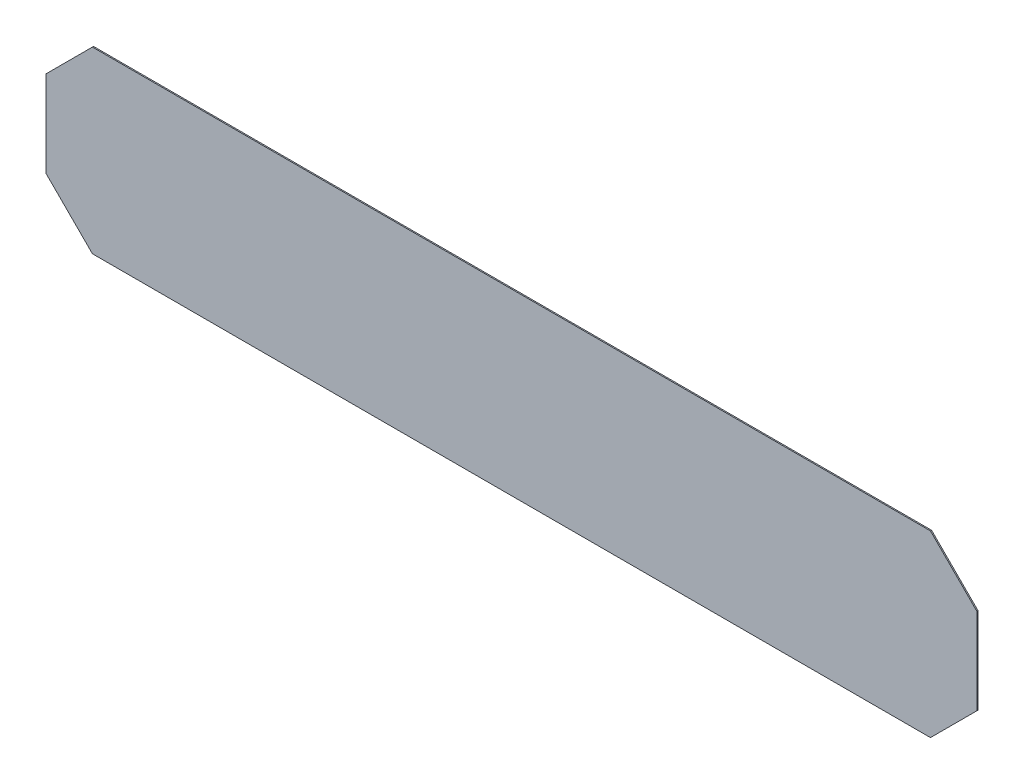
ISO-10303-21;
HEADER;
FILE_DESCRIPTION(('STEP AP214'),'2;1');
FILE_NAME('part.step','',(''),(''),'','','');
FILE_SCHEMA(('AUTOMOTIVE_DESIGN { 1 0 10303 214 1 1 1 1 }'));
ENDSEC;
DATA;
#1=APPLICATION_CONTEXT('core data for automotive mechanical design processes');
#2=APPLICATION_PROTOCOL_DEFINITION('international standard','automotive_design',2000,#1);
#3=PRODUCT_CONTEXT('',#1,'mechanical');
#4=PRODUCT('Part','Part','',(#3));
#5=PRODUCT_RELATED_PRODUCT_CATEGORY('part','',(#4));
#6=PRODUCT_DEFINITION_FORMATION('','',#4);
#7=PRODUCT_DEFINITION_CONTEXT('part definition',#1,'design');
#8=PRODUCT_DEFINITION('design','',#6,#7);
#9=PRODUCT_DEFINITION_SHAPE('','',#8);
#10=(LENGTH_UNIT() NAMED_UNIT(*) SI_UNIT(.MILLI.,.METRE.));
#11=(NAMED_UNIT(*) PLANE_ANGLE_UNIT() SI_UNIT($,.RADIAN.));
#12=(NAMED_UNIT(*) SI_UNIT($,.STERADIAN.) SOLID_ANGLE_UNIT());
#13=UNCERTAINTY_MEASURE_WITH_UNIT(LENGTH_MEASURE(1.E-05),#10,'distance_accuracy_value','');
#14=(GEOMETRIC_REPRESENTATION_CONTEXT(3) GLOBAL_UNCERTAINTY_ASSIGNED_CONTEXT((#13)) GLOBAL_UNIT_ASSIGNED_CONTEXT((#10,
#11,#12)) REPRESENTATION_CONTEXT('',''));
#15=CARTESIAN_POINT('',(0.,0.,0.));
#16=DIRECTION('',(0.,0.,1.));
#17=DIRECTION('',(1.,0.,0.));
#18=AXIS2_PLACEMENT_3D('',#15,#16,#17);
#19=CARTESIAN_POINT('',(41.275,7.9375,0.1016));
#20=DIRECTION('',(-1.,0.,0.));
#21=DIRECTION('',(0.,0.,1.));
#22=AXIS2_PLACEMENT_3D('',#19,#20,#21);
#23=PLANE('',#22);
#24=DIRECTION('',(0.,1.,0.));
#25=VECTOR('',#24,1.);
#26=CARTESIAN_POINT('',(41.275,7.9375,0.1016));
#27=LINE('',#26,#25);
#28=CARTESIAN_POINT('',(41.275,-3.82269999999998,0.1016));
#29=VERTEX_POINT('',#28);
#30=CARTESIAN_POINT('',(41.275,3.8227,0.1016));
#31=VERTEX_POINT('',#30);
#32=EDGE_CURVE('E130',#29,#31,#27,.T.);
#33=ORIENTED_EDGE('',*,*,#32,.F.);
#34=DIRECTION('',(0.,0.,-1.));
#35=VECTOR('',#34,1.);
#36=CARTESIAN_POINT('',(41.275,-3.82269999999998,0.1016));
#37=LINE('',#36,#35);
#38=CARTESIAN_POINT('',(41.275,-3.82269999999998,0.));
#39=VERTEX_POINT('',#38);
#40=EDGE_CURVE('E11',#29,#39,#37,.T.);
#41=ORIENTED_EDGE('',*,*,#40,.T.);
#42=DIRECTION('',(0.,1.,0.));
#43=VECTOR('',#42,1.);
#44=CARTESIAN_POINT('',(41.275,7.9375,0.));
#45=LINE('',#44,#43);
#46=CARTESIAN_POINT('',(41.275,3.8227,0.));
#47=VERTEX_POINT('',#46);
#48=EDGE_CURVE('E132',#39,#47,#45,.T.);
#49=ORIENTED_EDGE('',*,*,#48,.T.);
#50=DIRECTION('',(0.,0.,1.));
#51=VECTOR('',#50,1.);
#52=CARTESIAN_POINT('',(41.275,3.8227,0.1016));
#53=LINE('',#52,#51);
#54=EDGE_CURVE('E43',#47,#31,#53,.T.);
#55=ORIENTED_EDGE('',*,*,#54,.T.);
#56=EDGE_LOOP('',(#33,#41,#49,#55));
#57=FACE_BOUND('',#56,.T.);
#58=ADVANCED_FACE('F35',(#57),#23,.F.);
#59=CARTESIAN_POINT('',(-41.275,7.9375,0.1016));
#60=DIRECTION('',(0.,-1.,0.));
#61=DIRECTION('',(0.,0.,-1.));
#62=AXIS2_PLACEMENT_3D('',#59,#60,#61);
#63=PLANE('',#62);
#64=DIRECTION('',(-1.,0.,0.));
#65=VECTOR('',#64,1.);
#66=CARTESIAN_POINT('',(-41.275,7.9375,0.));
#67=LINE('',#66,#65);
#68=CARTESIAN_POINT('',(37.1602,7.9375,0.));
#69=VERTEX_POINT('',#68);
#70=CARTESIAN_POINT('',(-37.1602,7.9375,0.));
#71=VERTEX_POINT('',#70);
#72=EDGE_CURVE('E128',#69,#71,#67,.T.);
#73=ORIENTED_EDGE('',*,*,#72,.T.);
#74=DIRECTION('',(0.,0.,1.));
#75=VECTOR('',#74,1.);
#76=CARTESIAN_POINT('',(-37.1602,7.9375,0.1016));
#77=LINE('',#76,#75);
#78=CARTESIAN_POINT('',(-37.1602,7.9375,0.1016));
#79=VERTEX_POINT('',#78);
#80=EDGE_CURVE('E107',#71,#79,#77,.T.);
#81=ORIENTED_EDGE('',*,*,#80,.T.);
#82=DIRECTION('',(-1.,0.,0.));
#83=VECTOR('',#82,1.);
#84=CARTESIAN_POINT('',(-41.275,7.9375,0.1016));
#85=LINE('',#84,#83);
#86=CARTESIAN_POINT('',(37.1602,7.9375,0.1016));
#87=VERTEX_POINT('',#86);
#88=EDGE_CURVE('E168',#87,#79,#85,.T.);
#89=ORIENTED_EDGE('',*,*,#88,.F.);
#90=DIRECTION('',(0.,0.,-1.));
#91=VECTOR('',#90,1.);
#92=CARTESIAN_POINT('',(37.1602,7.9375,0.1016));
#93=LINE('',#92,#91);
#94=EDGE_CURVE('E112',#87,#69,#93,.T.);
#95=ORIENTED_EDGE('',*,*,#94,.T.);
#96=EDGE_LOOP('',(#73,#81,#89,#95));
#97=FACE_BOUND('',#96,.T.);
#98=ADVANCED_FACE('F172',(#97),#63,.F.);
#99=CARTESIAN_POINT('',(-41.275,7.9375,0.1016));
#100=DIRECTION('',(1.,0.,0.));
#101=DIRECTION('',(0.,0.,-1.));
#102=AXIS2_PLACEMENT_3D('',#99,#100,#101);
#103=PLANE('',#102);
#104=DIRECTION('',(0.,-1.,0.));
#105=VECTOR('',#104,1.);
#106=CARTESIAN_POINT('',(-41.275,7.9375,0.1016));
#107=LINE('',#106,#105);
#108=CARTESIAN_POINT('',(-41.275,3.82269999999998,0.1016));
#109=VERTEX_POINT('',#108);
#110=CARTESIAN_POINT('',(-41.275,-3.8227,0.1016));
#111=VERTEX_POINT('',#110);
#112=EDGE_CURVE('E121',#109,#111,#107,.T.);
#113=ORIENTED_EDGE('',*,*,#112,.F.);
#114=DIRECTION('',(0.,0.,-1.));
#115=VECTOR('',#114,1.);
#116=CARTESIAN_POINT('',(-41.275,3.82269999999998,0.1016));
#117=LINE('',#116,#115);
#118=CARTESIAN_POINT('',(-41.275,3.82269999999998,0.));
#119=VERTEX_POINT('',#118);
#120=EDGE_CURVE('E106',#109,#119,#117,.T.);
#121=ORIENTED_EDGE('',*,*,#120,.T.);
#122=DIRECTION('',(0.,-1.,0.));
#123=VECTOR('',#122,1.);
#124=CARTESIAN_POINT('',(-41.275,7.9375,0.));
#125=LINE('',#124,#123);
#126=CARTESIAN_POINT('',(-41.275,-3.8227,0.));
#127=VERTEX_POINT('',#126);
#128=EDGE_CURVE('E119',#119,#127,#125,.T.);
#129=ORIENTED_EDGE('',*,*,#128,.T.);
#130=DIRECTION('',(0.,0.,1.));
#131=VECTOR('',#130,1.);
#132=CARTESIAN_POINT('',(-41.275,-3.8227,0.1016));
#133=LINE('',#132,#131);
#134=EDGE_CURVE('E123',#127,#111,#133,.T.);
#135=ORIENTED_EDGE('',*,*,#134,.T.);
#136=EDGE_LOOP('',(#113,#121,#129,#135));
#137=FACE_BOUND('',#136,.T.);
#138=ADVANCED_FACE('F118',(#137),#103,.F.);
#139=CARTESIAN_POINT('',(-41.275,-7.9375,0.1016));
#140=DIRECTION('',(0.,1.,0.));
#141=DIRECTION('',(0.,0.,1.));
#142=AXIS2_PLACEMENT_3D('',#139,#140,#141);
#143=PLANE('',#142);
#144=DIRECTION('',(1.,0.,0.));
#145=VECTOR('',#144,1.);
#146=CARTESIAN_POINT('',(-41.275,-7.9375,0.1016));
#147=LINE('',#146,#145);
#148=CARTESIAN_POINT('',(-37.1602,-7.9375,0.1016));
#149=VERTEX_POINT('',#148);
#150=CARTESIAN_POINT('',(37.1602,-7.9375,0.1016));
#151=VERTEX_POINT('',#150);
#152=EDGE_CURVE('E136',#149,#151,#147,.T.);
#153=ORIENTED_EDGE('',*,*,#152,.F.);
#154=DIRECTION('',(0.,0.,-1.));
#155=VECTOR('',#154,1.);
#156=CARTESIAN_POINT('',(-37.1602,-7.9375,0.1016));
#157=LINE('',#156,#155);
#158=CARTESIAN_POINT('',(-37.1602,-7.9375,0.));
#159=VERTEX_POINT('',#158);
#160=EDGE_CURVE('E153',#149,#159,#157,.T.);
#161=ORIENTED_EDGE('',*,*,#160,.T.);
#162=DIRECTION('',(1.,0.,0.));
#163=VECTOR('',#162,1.);
#164=CARTESIAN_POINT('',(-41.275,-7.9375,0.));
#165=LINE('',#164,#163);
#166=CARTESIAN_POINT('',(37.1602,-7.9375,0.));
#167=VERTEX_POINT('',#166);
#168=EDGE_CURVE('E127',#159,#167,#165,.T.);
#169=ORIENTED_EDGE('',*,*,#168,.T.);
#170=DIRECTION('',(0.,0.,1.));
#171=VECTOR('',#170,1.);
#172=CARTESIAN_POINT('',(37.1602,-7.9375,0.1016));
#173=LINE('',#172,#171);
#174=EDGE_CURVE('E50',#167,#151,#173,.T.);
#175=ORIENTED_EDGE('',*,*,#174,.T.);
#176=EDGE_LOOP('',(#153,#161,#169,#175));
#177=FACE_BOUND('',#176,.T.);
#178=ADVANCED_FACE('F179',(#177),#143,.F.);
#179=CARTESIAN_POINT('',(0.,0.,0.1016));
#180=DIRECTION('',(0.,0.,1.));
#181=DIRECTION('',(1.,0.,0.));
#182=AXIS2_PLACEMENT_3D('',#179,#180,#181);
#183=PLANE('',#182);
#184=ORIENTED_EDGE('',*,*,#88,.T.);
#185=DIRECTION('',(0.707106781186548,0.707106781186548,0.));
#186=VECTOR('',#185,1.);
#187=CARTESIAN_POINT('',(-22.54885,22.54885,0.1016));
#188=LINE('',#187,#186);
#189=EDGE_CURVE('E150',#79,#109,#188,.F.);
#190=ORIENTED_EDGE('',*,*,#189,.T.);
#191=ORIENTED_EDGE('',*,*,#112,.T.);
#192=DIRECTION('',(-0.707106781186548,0.707106781186548,0.));
#193=VECTOR('',#192,1.);
#194=CARTESIAN_POINT('',(-22.54885,-22.54885,0.1016));
#195=LINE('',#194,#193);
#196=EDGE_CURVE('E57',#111,#149,#195,.F.);
#197=ORIENTED_EDGE('',*,*,#196,.T.);
#198=ORIENTED_EDGE('',*,*,#152,.T.);
#199=DIRECTION('',(-0.707106781186548,-0.707106781186548,0.));
#200=VECTOR('',#199,1.);
#201=CARTESIAN_POINT('',(22.54885,-22.54885,0.1016));
#202=LINE('',#201,#200);
#203=EDGE_CURVE('E147',#151,#29,#202,.F.);
#204=ORIENTED_EDGE('',*,*,#203,.T.);
#205=ORIENTED_EDGE('',*,*,#32,.T.);
#206=DIRECTION('',(0.707106781186548,-0.707106781186548,0.));
#207=VECTOR('',#206,1.);
#208=CARTESIAN_POINT('',(22.54885,22.54885,0.1016));
#209=LINE('',#208,#207);
#210=EDGE_CURVE('E145',#31,#87,#209,.F.);
#211=ORIENTED_EDGE('',*,*,#210,.T.);
#212=EDGE_LOOP('',(#184,#190,#191,#197,#198,#204,#205,#211));
#213=FACE_BOUND('',#212,.T.);
#214=ADVANCED_FACE('F165',(#213),#183,.T.);
#215=CARTESIAN_POINT('',(0.,0.,0.));
#216=DIRECTION('',(0.,0.,1.));
#217=DIRECTION('',(1.,0.,0.));
#218=AXIS2_PLACEMENT_3D('',#215,#216,#217);
#219=PLANE('',#218);
#220=ORIENTED_EDGE('',*,*,#128,.F.);
#221=DIRECTION('',(-0.707106781186548,-0.707106781186548,0.));
#222=VECTOR('',#221,1.);
#223=CARTESIAN_POINT('',(-41.275,3.82269999999998,0.));
#224=LINE('',#223,#222);
#225=EDGE_CURVE('E102',#119,#71,#224,.F.);
#226=ORIENTED_EDGE('',*,*,#225,.T.);
#227=ORIENTED_EDGE('',*,*,#72,.F.);
#228=DIRECTION('',(-0.707106781186548,0.707106781186548,0.));
#229=VECTOR('',#228,1.);
#230=CARTESIAN_POINT('',(37.1602,7.9375,0.));
#231=LINE('',#230,#229);
#232=EDGE_CURVE('E122',#69,#47,#231,.F.);
#233=ORIENTED_EDGE('',*,*,#232,.T.);
#234=ORIENTED_EDGE('',*,*,#48,.F.);
#235=DIRECTION('',(0.707106781186548,0.707106781186548,0.));
#236=VECTOR('',#235,1.);
#237=CARTESIAN_POINT('',(41.275,-3.82269999999998,0.));
#238=LINE('',#237,#236);
#239=EDGE_CURVE('E139',#39,#167,#238,.F.);
#240=ORIENTED_EDGE('',*,*,#239,.T.);
#241=ORIENTED_EDGE('',*,*,#168,.F.);
#242=DIRECTION('',(0.707106781186548,-0.707106781186548,0.));
#243=VECTOR('',#242,1.);
#244=CARTESIAN_POINT('',(-37.1602,-7.9375,0.));
#245=LINE('',#244,#243);
#246=EDGE_CURVE('E113',#159,#127,#245,.F.);
#247=ORIENTED_EDGE('',*,*,#246,.T.);
#248=EDGE_LOOP('',(#220,#226,#227,#233,#234,#240,#241,#247));
#249=FACE_BOUND('',#248,.T.);
#250=ADVANCED_FACE('F125',(#249),#219,.F.);
#251=CARTESIAN_POINT('',(-41.275,3.82269999999998,0.1016));
#252=DIRECTION('',(0.707106781186547,-0.707106781186547,0.));
#253=DIRECTION('',(0.,0.,-1.));
#254=AXIS2_PLACEMENT_3D('',#251,#252,#253);
#255=PLANE('',#254);
#256=ORIENTED_EDGE('',*,*,#189,.F.);
#257=ORIENTED_EDGE('',*,*,#80,.F.);
#258=ORIENTED_EDGE('',*,*,#225,.F.);
#259=ORIENTED_EDGE('',*,*,#120,.F.);
#260=EDGE_LOOP('',(#256,#257,#258,#259));
#261=FACE_BOUND('',#260,.T.);
#262=ADVANCED_FACE('F105',(#261),#255,.F.);
#263=CARTESIAN_POINT('',(-37.1602,-7.9375,0.1016));
#264=DIRECTION('',(0.707106781186548,0.707106781186548,0.));
#265=DIRECTION('',(0.,0.,-1.));
#266=AXIS2_PLACEMENT_3D('',#263,#264,#265);
#267=PLANE('',#266);
#268=ORIENTED_EDGE('',*,*,#196,.F.);
#269=ORIENTED_EDGE('',*,*,#134,.F.);
#270=ORIENTED_EDGE('',*,*,#246,.F.);
#271=ORIENTED_EDGE('',*,*,#160,.F.);
#272=EDGE_LOOP('',(#268,#269,#270,#271));
#273=FACE_BOUND('',#272,.T.);
#274=ADVANCED_FACE('F178',(#273),#267,.F.);
#275=CARTESIAN_POINT('',(41.275,-3.82269999999998,0.1016));
#276=DIRECTION('',(-0.707106781186547,0.707106781186547,0.));
#277=DIRECTION('',(0.,0.,-1.));
#278=AXIS2_PLACEMENT_3D('',#275,#276,#277);
#279=PLANE('',#278);
#280=ORIENTED_EDGE('',*,*,#203,.F.);
#281=ORIENTED_EDGE('',*,*,#174,.F.);
#282=ORIENTED_EDGE('',*,*,#239,.F.);
#283=ORIENTED_EDGE('',*,*,#40,.F.);
#284=EDGE_LOOP('',(#280,#281,#282,#283));
#285=FACE_BOUND('',#284,.T.);
#286=ADVANCED_FACE('F181',(#285),#279,.F.);
#287=CARTESIAN_POINT('',(37.1602,7.9375,0.1016));
#288=DIRECTION('',(-0.707106781186548,-0.707106781186548,0.));
#289=DIRECTION('',(0.,0.,-1.));
#290=AXIS2_PLACEMENT_3D('',#287,#288,#289);
#291=PLANE('',#290);
#292=ORIENTED_EDGE('',*,*,#210,.F.);
#293=ORIENTED_EDGE('',*,*,#54,.F.);
#294=ORIENTED_EDGE('',*,*,#232,.F.);
#295=ORIENTED_EDGE('',*,*,#94,.F.);
#296=EDGE_LOOP('',(#292,#293,#294,#295));
#297=FACE_BOUND('',#296,.T.);
#298=ADVANCED_FACE('F37',(#297),#291,.F.);
#299=CLOSED_SHELL('',(#58,#98,#138,#178,#214,#250,#262,#274,#286,#298));
#300=MANIFOLD_SOLID_BREP('B2',#299);
#301=ADVANCED_BREP_SHAPE_REPRESENTATION('',(#18,#300),#14);
#302=SHAPE_DEFINITION_REPRESENTATION(#9,#301);
ENDSEC;
END-ISO-10303-21;
